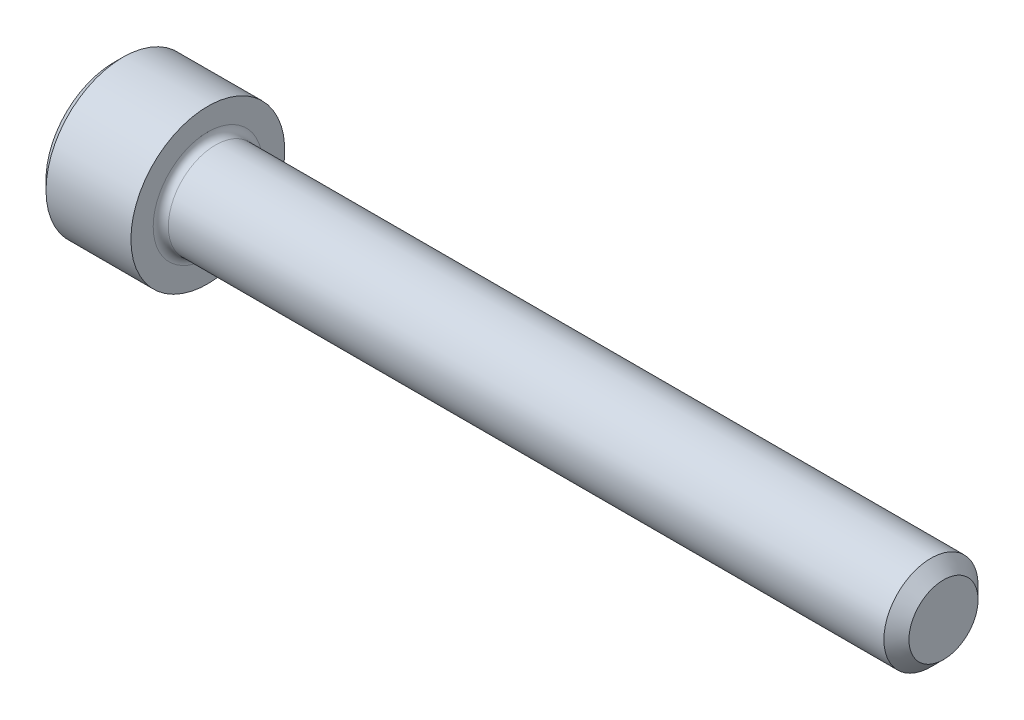
ISO-10303-21;
HEADER;
FILE_DESCRIPTION(('STEP AP214'),'2;1');
FILE_NAME('part.step','',(''),(''),'','','');
FILE_SCHEMA(('AUTOMOTIVE_DESIGN { 1 0 10303 214 1 1 1 1 }'));
ENDSEC;
DATA;
#1=APPLICATION_CONTEXT('core data for automotive mechanical design processes');
#2=APPLICATION_PROTOCOL_DEFINITION('international standard','automotive_design',2000,#1);
#3=PRODUCT_CONTEXT('',#1,'mechanical');
#4=PRODUCT('Part','Part','',(#3));
#5=PRODUCT_RELATED_PRODUCT_CATEGORY('part','',(#4));
#6=PRODUCT_DEFINITION_FORMATION('','',#4);
#7=PRODUCT_DEFINITION_CONTEXT('part definition',#1,'design');
#8=PRODUCT_DEFINITION('design','',#6,#7);
#9=PRODUCT_DEFINITION_SHAPE('','',#8);
#10=(LENGTH_UNIT() NAMED_UNIT(*) SI_UNIT(.MILLI.,.METRE.));
#11=(NAMED_UNIT(*) PLANE_ANGLE_UNIT() SI_UNIT($,.RADIAN.));
#12=(NAMED_UNIT(*) SI_UNIT($,.STERADIAN.) SOLID_ANGLE_UNIT());
#13=UNCERTAINTY_MEASURE_WITH_UNIT(LENGTH_MEASURE(1.E-05),#10,'distance_accuracy_value','');
#14=(GEOMETRIC_REPRESENTATION_CONTEXT(3) GLOBAL_UNCERTAINTY_ASSIGNED_CONTEXT((#13)) GLOBAL_UNIT_ASSIGNED_CONTEXT((#10,
#11,#12)) REPRESENTATION_CONTEXT('',''));
#15=CARTESIAN_POINT('',(0.,0.,0.));
#16=DIRECTION('',(0.,0.,1.));
#17=DIRECTION('',(1.,0.,0.));
#18=AXIS2_PLACEMENT_3D('',#15,#16,#17);
#19=CARTESIAN_POINT('',(1.29540000000361,0.,0.));
#20=DIRECTION('',(-1.,0.,0.));
#21=DIRECTION('',(0.,0.,1.));
#22=AXIS2_PLACEMENT_3D('',#19,#20,#21);
#23=CONICAL_SURFACE('',#22,1.19380000001001,1.04719755115437);
#24=CARTESIAN_POINT('',(1.98464075137395,0.,2.8421709430404E-11));
#25=VERTEX_POINT('',#24);
#26=VERTEX_LOOP('',#25);
#27=FACE_BOUND('',#26,.T.);
#28=CARTESIAN_POINT('',(1.29540000000361,0.,0.));
#29=DIRECTION('',(-1.,0.,0.));
#30=DIRECTION('',(0.,0.,1.));
#31=AXIS2_PLACEMENT_3D('',#28,#29,#30);
#32=CIRCLE('',#31,1.19380000001001);
#33=CARTESIAN_POINT('',(1.29540000000181,0.,1.19380000000501));
#34=VERTEX_POINT('',#33);
#35=CARTESIAN_POINT('',(1.29540000000181,-1.0338611270422,0.596900000002504));
#36=VERTEX_POINT('',#35);
#37=EDGE_CURVE('E99',#34,#36,#32,.F.);
#38=ORIENTED_EDGE('',*,*,#37,.F.);
#39=CARTESIAN_POINT('',(1.29540000000361,0.,0.));
#40=DIRECTION('',(-1.,0.,0.));
#41=DIRECTION('',(0.,0.,1.));
#42=AXIS2_PLACEMENT_3D('',#39,#40,#41);
#43=CIRCLE('',#42,1.19380000001001);
#44=CARTESIAN_POINT('',(1.29540000000181,1.0338611270422,0.596900000002503));
#45=VERTEX_POINT('',#44);
#46=EDGE_CURVE('E96',#45,#34,#43,.F.);
#47=ORIENTED_EDGE('',*,*,#46,.F.);
#48=CARTESIAN_POINT('',(1.29540000000361,0.,0.));
#49=DIRECTION('',(-1.,0.,0.));
#50=DIRECTION('',(0.,0.,1.));
#51=AXIS2_PLACEMENT_3D('',#48,#49,#50);
#52=CIRCLE('',#51,1.19380000001001);
#53=CARTESIAN_POINT('',(1.2954000000018,1.0338611270422,-0.596900000002507));
#54=VERTEX_POINT('',#53);
#55=EDGE_CURVE('E157',#54,#45,#52,.F.);
#56=ORIENTED_EDGE('',*,*,#55,.F.);
#57=CARTESIAN_POINT('',(1.29540000000361,0.,0.));
#58=DIRECTION('',(-1.,0.,0.));
#59=DIRECTION('',(0.,0.,1.));
#60=AXIS2_PLACEMENT_3D('',#57,#58,#59);
#61=CIRCLE('',#60,1.19380000001001);
#62=CARTESIAN_POINT('',(1.29540000000181,0.,-1.19380000000501));
#63=VERTEX_POINT('',#62);
#64=EDGE_CURVE('E154',#63,#54,#61,.F.);
#65=ORIENTED_EDGE('',*,*,#64,.F.);
#66=CARTESIAN_POINT('',(1.29540000000361,0.,0.));
#67=DIRECTION('',(-1.,0.,0.));
#68=DIRECTION('',(0.,0.,1.));
#69=AXIS2_PLACEMENT_3D('',#66,#67,#68);
#70=CIRCLE('',#69,1.19380000001001);
#71=CARTESIAN_POINT('',(1.29540000000181,-1.0338611270422,-0.596900000002501));
#72=VERTEX_POINT('',#71);
#73=EDGE_CURVE('E159',#72,#63,#70,.F.);
#74=ORIENTED_EDGE('',*,*,#73,.F.);
#75=CARTESIAN_POINT('',(1.29540000000361,0.,0.));
#76=DIRECTION('',(-1.,0.,0.));
#77=DIRECTION('',(0.,0.,1.));
#78=AXIS2_PLACEMENT_3D('',#75,#76,#77);
#79=CIRCLE('',#78,1.19380000001001);
#80=EDGE_CURVE('E102',#36,#72,#79,.F.);
#81=ORIENTED_EDGE('',*,*,#80,.F.);
#82=EDGE_LOOP('',(#38,#47,#56,#65,#74,#81));
#83=FACE_BOUND('',#82,.T.);
#84=ADVANCED_FACE('F17',(#27,#83),#23,.F.);
#85=CARTESIAN_POINT('',(1.2954,0.689240751358581,1.1938));
#86=DIRECTION('',(-1.,0.,0.));
#87=DIRECTION('',(0.,0.,1.));
#88=AXIS2_PLACEMENT_3D('',#85,#86,#87);
#89=PLANE('',#88);
#90=DIRECTION('',(0.,-1.,0.));
#91=VECTOR('',#90,1.);
#92=CARTESIAN_POINT('',(1.2954,-0.689240751358569,1.1938));
#93=LINE('',#92,#91);
#94=CARTESIAN_POINT('',(1.2954,0.689240751358582,1.1938));
#95=VERTEX_POINT('',#94);
#96=EDGE_CURVE('E114',#34,#95,#93,.F.);
#97=ORIENTED_EDGE('',*,*,#96,.T.);
#98=DIRECTION('',(0.,0.499999999999999,-0.866025403784439));
#99=VECTOR('',#98,1.);
#100=CARTESIAN_POINT('',(1.2954,1.37848150271716,0.));
#101=LINE('',#100,#99);
#102=EDGE_CURVE('E115',#45,#95,#101,.F.);
#103=ORIENTED_EDGE('',*,*,#102,.F.);
#104=ORIENTED_EDGE('',*,*,#46,.T.);
#105=EDGE_LOOP('',(#97,#103,#104));
#106=FACE_BOUND('',#105,.T.);
#107=ADVANCED_FACE('F119',(#106),#89,.T.);
#108=CARTESIAN_POINT('',(1.2954,0.689240751358581,1.1938));
#109=DIRECTION('',(-1.,0.,0.));
#110=DIRECTION('',(0.,0.,1.));
#111=AXIS2_PLACEMENT_3D('',#108,#109,#110);
#112=PLANE('',#111);
#113=DIRECTION('',(0.,0.500000000000001,0.866025403784438));
#114=VECTOR('',#113,1.);
#115=CARTESIAN_POINT('',(1.2954,-0.689240751358569,1.1938));
#116=LINE('',#115,#114);
#117=CARTESIAN_POINT('',(1.2954,-0.689240751358569,1.1938));
#118=VERTEX_POINT('',#117);
#119=EDGE_CURVE('E110',#118,#36,#116,.F.);
#120=ORIENTED_EDGE('',*,*,#119,.F.);
#121=DIRECTION('',(0.,-1.,0.));
#122=VECTOR('',#121,1.);
#123=CARTESIAN_POINT('',(1.2954,-0.689240751358569,1.1938));
#124=LINE('',#123,#122);
#125=EDGE_CURVE('E107',#118,#34,#124,.F.);
#126=ORIENTED_EDGE('',*,*,#125,.T.);
#127=ORIENTED_EDGE('',*,*,#37,.T.);
#128=EDGE_LOOP('',(#120,#126,#127));
#129=FACE_BOUND('',#128,.T.);
#130=ADVANCED_FACE('F108',(#129),#112,.T.);
#131=CARTESIAN_POINT('',(1.2954,0.689240751358581,1.1938));
#132=DIRECTION('',(-1.,0.,0.));
#133=DIRECTION('',(0.,0.,1.));
#134=AXIS2_PLACEMENT_3D('',#131,#132,#133);
#135=PLANE('',#134);
#136=DIRECTION('',(0.,-0.499999999999998,0.86602540378444));
#137=VECTOR('',#136,1.);
#138=CARTESIAN_POINT('',(1.2954,-1.37848150271715,0.));
#139=LINE('',#138,#137);
#140=CARTESIAN_POINT('',(1.2954,-1.37848150271715,0.));
#141=VERTEX_POINT('',#140);
#142=EDGE_CURVE('E416',#141,#72,#139,.F.);
#143=ORIENTED_EDGE('',*,*,#142,.F.);
#144=DIRECTION('',(0.,0.500000000000001,0.866025403784438));
#145=VECTOR('',#144,1.);
#146=CARTESIAN_POINT('',(1.2954,-0.689240751358569,1.1938));
#147=LINE('',#146,#145);
#148=EDGE_CURVE('E418',#36,#141,#147,.F.);
#149=ORIENTED_EDGE('',*,*,#148,.F.);
#150=ORIENTED_EDGE('',*,*,#80,.T.);
#151=EDGE_LOOP('',(#143,#149,#150));
#152=FACE_BOUND('',#151,.T.);
#153=ADVANCED_FACE('F278',(#152),#135,.T.);
#154=CARTESIAN_POINT('',(1.2954,0.689240751358581,1.1938));
#155=DIRECTION('',(-1.,0.,0.));
#156=DIRECTION('',(0.,0.,1.));
#157=AXIS2_PLACEMENT_3D('',#154,#155,#156);
#158=PLANE('',#157);
#159=DIRECTION('',(0.,1.,0.));
#160=VECTOR('',#159,1.);
#161=CARTESIAN_POINT('',(1.2954,0.689240751358578,-1.1938));
#162=LINE('',#161,#160);
#163=CARTESIAN_POINT('',(1.2954,-0.689240751358572,-1.1938));
#164=VERTEX_POINT('',#163);
#165=EDGE_CURVE('E472',#63,#164,#162,.F.);
#166=ORIENTED_EDGE('',*,*,#165,.T.);
#167=DIRECTION('',(0.,-0.499999999999998,0.86602540378444));
#168=VECTOR('',#167,1.);
#169=CARTESIAN_POINT('',(1.2954,-1.37848150271715,0.));
#170=LINE('',#169,#168);
#171=EDGE_CURVE('E421',#72,#164,#170,.F.);
#172=ORIENTED_EDGE('',*,*,#171,.F.);
#173=ORIENTED_EDGE('',*,*,#73,.T.);
#174=EDGE_LOOP('',(#166,#172,#173));
#175=FACE_BOUND('',#174,.T.);
#176=ADVANCED_FACE('F274',(#175),#158,.T.);
#177=CARTESIAN_POINT('',(1.2954,0.689240751358581,1.1938));
#178=DIRECTION('',(-1.,0.,0.));
#179=DIRECTION('',(0.,0.,1.));
#180=AXIS2_PLACEMENT_3D('',#177,#178,#179);
#181=PLANE('',#180);
#182=DIRECTION('',(0.,0.499999999999999,-0.866025403784439));
#183=VECTOR('',#182,1.);
#184=CARTESIAN_POINT('',(1.2954,1.37848150271716,0.));
#185=LINE('',#184,#183);
#186=CARTESIAN_POINT('',(1.2954,1.37848150271716,0.));
#187=VERTEX_POINT('',#186);
#188=EDGE_CURVE('E137',#187,#45,#185,.F.);
#189=ORIENTED_EDGE('',*,*,#188,.F.);
#190=DIRECTION('',(0.,0.500000000000001,0.866025403784438));
#191=VECTOR('',#190,1.);
#192=CARTESIAN_POINT('',(1.2954,1.37848150271716,0.));
#193=LINE('',#192,#191);
#194=EDGE_CURVE('E487',#187,#54,#193,.F.);
#195=ORIENTED_EDGE('',*,*,#194,.T.);
#196=ORIENTED_EDGE('',*,*,#55,.T.);
#197=EDGE_LOOP('',(#189,#195,#196));
#198=FACE_BOUND('',#197,.T.);
#199=ADVANCED_FACE('F270',(#198),#181,.T.);
#200=CARTESIAN_POINT('',(1.2954,0.689240751358581,1.1938));
#201=DIRECTION('',(-1.,0.,0.));
#202=DIRECTION('',(0.,0.,1.));
#203=AXIS2_PLACEMENT_3D('',#200,#201,#202);
#204=PLANE('',#203);
#205=DIRECTION('',(0.,0.500000000000001,0.866025403784438));
#206=VECTOR('',#205,1.);
#207=CARTESIAN_POINT('',(1.2954,1.37848150271716,0.));
#208=LINE('',#207,#206);
#209=CARTESIAN_POINT('',(1.2954,0.689240751358578,-1.1938));
#210=VERTEX_POINT('',#209);
#211=EDGE_CURVE('E461',#54,#210,#208,.F.);
#212=ORIENTED_EDGE('',*,*,#211,.T.);
#213=DIRECTION('',(0.,1.,0.));
#214=VECTOR('',#213,1.);
#215=CARTESIAN_POINT('',(1.2954,0.689240751358578,-1.1938));
#216=LINE('',#215,#214);
#217=EDGE_CURVE('E475',#210,#63,#216,.F.);
#218=ORIENTED_EDGE('',*,*,#217,.T.);
#219=ORIENTED_EDGE('',*,*,#64,.T.);
#220=EDGE_LOOP('',(#212,#218,#219));
#221=FACE_BOUND('',#220,.T.);
#222=ADVANCED_FACE('F266',(#221),#204,.T.);
#223=CARTESIAN_POINT('',(1.2954,1.37848150271716,0.));
#224=DIRECTION('',(0.,-0.866025403784439,-0.499999999999999));
#225=DIRECTION('',(0.,0.499999999999999,-0.866025403784439));
#226=AXIS2_PLACEMENT_3D('',#223,#224,#225);
#227=PLANE('',#226);
#228=ORIENTED_EDGE('',*,*,#102,.T.);
#229=DIRECTION('',(1.,0.,0.));
#230=VECTOR('',#229,1.);
#231=CARTESIAN_POINT('',(1.2954,0.689240751358582,1.1938));
#232=LINE('',#231,#230);
#233=CARTESIAN_POINT('',(0.,0.689240751358582,1.1938));
#234=VERTEX_POINT('',#233);
#235=EDGE_CURVE('E126',#95,#234,#232,.F.);
#236=ORIENTED_EDGE('',*,*,#235,.T.);
#237=DIRECTION('',(0.,-0.499999999999999,0.866025403784439));
#238=VECTOR('',#237,1.);
#239=CARTESIAN_POINT('',(0.,1.37848150271716,0.));
#240=LINE('',#239,#238);
#241=CARTESIAN_POINT('',(0.,1.37848150271716,0.));
#242=VERTEX_POINT('',#241);
#243=EDGE_CURVE('E455',#242,#234,#240,.T.);
#244=ORIENTED_EDGE('',*,*,#243,.F.);
#245=DIRECTION('',(1.,0.,0.));
#246=VECTOR('',#245,1.);
#247=CARTESIAN_POINT('',(1.2954,1.37848150271716,0.));
#248=LINE('',#247,#246);
#249=EDGE_CURVE('E482',#242,#187,#248,.T.);
#250=ORIENTED_EDGE('',*,*,#249,.T.);
#251=ORIENTED_EDGE('',*,*,#188,.T.);
#252=EDGE_LOOP('',(#228,#236,#244,#250,#251));
#253=FACE_BOUND('',#252,.T.);
#254=ADVANCED_FACE('F263',(#253),#227,.T.);
#255=CARTESIAN_POINT('',(1.2954,-0.689240751358569,1.1938));
#256=DIRECTION('',(0.,0.,1.));
#257=DIRECTION('',(0.,-1.,0.));
#258=AXIS2_PLACEMENT_3D('',#255,#256,#257);
#259=PLANE('',#258);
#260=ORIENTED_EDGE('',*,*,#235,.F.);
#261=ORIENTED_EDGE('',*,*,#96,.F.);
#262=ORIENTED_EDGE('',*,*,#125,.F.);
#263=DIRECTION('',(1.,0.,0.));
#264=VECTOR('',#263,1.);
#265=CARTESIAN_POINT('',(1.2954,-0.689240751358569,1.1938));
#266=LINE('',#265,#264);
#267=CARTESIAN_POINT('',(0.,-0.689240751358569,1.1938));
#268=VERTEX_POINT('',#267);
#269=EDGE_CURVE('E128',#268,#118,#266,.T.);
#270=ORIENTED_EDGE('',*,*,#269,.F.);
#271=DIRECTION('',(0.,1.,0.));
#272=VECTOR('',#271,1.);
#273=CARTESIAN_POINT('',(0.,0.,1.1938));
#274=LINE('',#273,#272);
#275=EDGE_CURVE('E444',#234,#268,#274,.F.);
#276=ORIENTED_EDGE('',*,*,#275,.F.);
#277=EDGE_LOOP('',(#260,#261,#262,#270,#276));
#278=FACE_BOUND('',#277,.T.);
#279=ADVANCED_FACE('F124',(#278),#259,.F.);
#280=CARTESIAN_POINT('',(1.2954,-0.689240751358569,1.1938));
#281=DIRECTION('',(0.,0.866025403784438,-0.500000000000001));
#282=DIRECTION('',(0.,0.500000000000001,0.866025403784438));
#283=AXIS2_PLACEMENT_3D('',#280,#281,#282);
#284=PLANE('',#283);
#285=ORIENTED_EDGE('',*,*,#148,.T.);
#286=DIRECTION('',(1.,0.,0.));
#287=VECTOR('',#286,1.);
#288=CARTESIAN_POINT('',(1.2954,-1.37848150271715,0.));
#289=LINE('',#288,#287);
#290=CARTESIAN_POINT('',(0.,-1.37848150271715,0.));
#291=VERTEX_POINT('',#290);
#292=EDGE_CURVE('E422',#291,#141,#289,.T.);
#293=ORIENTED_EDGE('',*,*,#292,.F.);
#294=DIRECTION('',(0.,-0.500000000000001,-0.866025403784438));
#295=VECTOR('',#294,1.);
#296=CARTESIAN_POINT('',(0.,-0.689240751358569,1.1938));
#297=LINE('',#296,#295);
#298=EDGE_CURVE('E440',#268,#291,#297,.T.);
#299=ORIENTED_EDGE('',*,*,#298,.F.);
#300=ORIENTED_EDGE('',*,*,#269,.T.);
#301=ORIENTED_EDGE('',*,*,#119,.T.);
#302=EDGE_LOOP('',(#285,#293,#299,#300,#301));
#303=FACE_BOUND('',#302,.T.);
#304=ADVANCED_FACE('F256',(#303),#284,.T.);
#305=CARTESIAN_POINT('',(1.2954,-1.37848150271715,0.));
#306=DIRECTION('',(0.,0.86602540378444,0.499999999999998));
#307=DIRECTION('',(0.,-0.499999999999998,0.86602540378444));
#308=AXIS2_PLACEMENT_3D('',#305,#306,#307);
#309=PLANE('',#308);
#310=ORIENTED_EDGE('',*,*,#171,.T.);
#311=DIRECTION('',(1.,0.,0.));
#312=VECTOR('',#311,1.);
#313=CARTESIAN_POINT('',(1.2954,-0.689240751358573,-1.1938));
#314=LINE('',#313,#312);
#315=CARTESIAN_POINT('',(0.,-0.689240751358573,-1.1938));
#316=VERTEX_POINT('',#315);
#317=EDGE_CURVE('E474',#164,#316,#314,.F.);
#318=ORIENTED_EDGE('',*,*,#317,.T.);
#319=DIRECTION('',(0.,0.499999999999998,-0.86602540378444));
#320=VECTOR('',#319,1.);
#321=CARTESIAN_POINT('',(0.,-1.37848150271715,0.));
#322=LINE('',#321,#320);
#323=EDGE_CURVE('E426',#291,#316,#322,.T.);
#324=ORIENTED_EDGE('',*,*,#323,.F.);
#325=ORIENTED_EDGE('',*,*,#292,.T.);
#326=ORIENTED_EDGE('',*,*,#142,.T.);
#327=EDGE_LOOP('',(#310,#318,#324,#325,#326));
#328=FACE_BOUND('',#327,.T.);
#329=ADVANCED_FACE('F252',(#328),#309,.T.);
#330=CARTESIAN_POINT('',(1.2954,0.689240751358578,-1.1938));
#331=DIRECTION('',(0.,0.,-1.));
#332=DIRECTION('',(0.,1.,0.));
#333=AXIS2_PLACEMENT_3D('',#330,#331,#332);
#334=PLANE('',#333);
#335=ORIENTED_EDGE('',*,*,#317,.F.);
#336=ORIENTED_EDGE('',*,*,#165,.F.);
#337=ORIENTED_EDGE('',*,*,#217,.F.);
#338=DIRECTION('',(1.,0.,0.));
#339=VECTOR('',#338,1.);
#340=CARTESIAN_POINT('',(1.2954,0.689240751358578,-1.1938));
#341=LINE('',#340,#339);
#342=CARTESIAN_POINT('',(0.,0.689240751358578,-1.1938));
#343=VERTEX_POINT('',#342);
#344=EDGE_CURVE('E458',#210,#343,#341,.F.);
#345=ORIENTED_EDGE('',*,*,#344,.T.);
#346=DIRECTION('',(0.,1.,0.));
#347=VECTOR('',#346,1.);
#348=CARTESIAN_POINT('',(0.,0.,-1.1938));
#349=LINE('',#348,#347);
#350=EDGE_CURVE('E439',#316,#343,#349,.T.);
#351=ORIENTED_EDGE('',*,*,#350,.F.);
#352=EDGE_LOOP('',(#335,#336,#337,#345,#351));
#353=FACE_BOUND('',#352,.T.);
#354=ADVANCED_FACE('F248',(#353),#334,.F.);
#355=CARTESIAN_POINT('',(1.2954,1.37848150271716,0.));
#356=DIRECTION('',(0.,0.866025403784438,-0.500000000000001));
#357=DIRECTION('',(0.,0.500000000000001,0.866025403784438));
#358=AXIS2_PLACEMENT_3D('',#355,#356,#357);
#359=PLANE('',#358);
#360=ORIENTED_EDGE('',*,*,#344,.F.);
#361=ORIENTED_EDGE('',*,*,#211,.F.);
#362=ORIENTED_EDGE('',*,*,#194,.F.);
#363=ORIENTED_EDGE('',*,*,#249,.F.);
#364=DIRECTION('',(0.,0.500000000000001,0.866025403784438));
#365=VECTOR('',#364,1.);
#366=CARTESIAN_POINT('',(0.,0.689240751358578,-1.1938));
#367=LINE('',#366,#365);
#368=EDGE_CURVE('E153',#343,#242,#367,.T.);
#369=ORIENTED_EDGE('',*,*,#368,.F.);
#370=EDGE_LOOP('',(#360,#361,#362,#363,#369));
#371=FACE_BOUND('',#370,.T.);
#372=ADVANCED_FACE('F244',(#371),#359,.F.);
#373=CARTESIAN_POINT('',(0.,0.,0.));
#374=DIRECTION('',(-1.,0.,0.));
#375=DIRECTION('',(0.,0.,1.));
#376=AXIS2_PLACEMENT_3D('',#373,#374,#375);
#377=PLANE('',#376);
#378=CARTESIAN_POINT('',(0.,0.,0.));
#379=DIRECTION('',(1.,0.,0.));
#380=DIRECTION('',(0.,0.,-1.));
#381=AXIS2_PLACEMENT_3D('',#378,#379,#380);
#382=CIRCLE('',#381,2.04469999994217);
#383=CARTESIAN_POINT('',(0.,0.,-2.04469999994217));
#384=VERTEX_POINT('',#383);
#385=EDGE_CURVE('E150',#384,#384,#382,.T.);
#386=ORIENTED_EDGE('',*,*,#385,.F.);
#387=EDGE_LOOP('',(#386));
#388=FACE_BOUND('',#387,.T.);
#389=ORIENTED_EDGE('',*,*,#350,.T.);
#390=ORIENTED_EDGE('',*,*,#368,.T.);
#391=ORIENTED_EDGE('',*,*,#243,.T.);
#392=ORIENTED_EDGE('',*,*,#275,.T.);
#393=ORIENTED_EDGE('',*,*,#298,.T.);
#394=ORIENTED_EDGE('',*,*,#323,.T.);
#395=EDGE_LOOP('',(#389,#390,#391,#392,#393,#394));
#396=FACE_BOUND('',#395,.T.);
#397=ADVANCED_FACE('F236',(#388,#396),#377,.T.);
#398=CARTESIAN_POINT('',(0.27940000001081,0.,0.));
#399=DIRECTION('',(1.,0.,0.));
#400=DIRECTION('',(0.,0.,-1.));
#401=AXIS2_PLACEMENT_3D('',#398,#399,#400);
#402=CONICAL_SURFACE('',#401,2.32409999995298,0.785398163397448);
#403=ORIENTED_EDGE('',*,*,#385,.T.);
#404=EDGE_LOOP('',(#403));
#405=FACE_BOUND('',#404,.T.);
#406=CARTESIAN_POINT('',(0.279399999999999,0.,0.));
#407=DIRECTION('',(-1.,0.,0.));
#408=DIRECTION('',(0.,0.,1.));
#409=AXIS2_PLACEMENT_3D('',#406,#407,#408);
#410=CIRCLE('',#409,2.3241);
#411=CARTESIAN_POINT('',(0.279399999999999,0.,2.3241));
#412=VERTEX_POINT('',#411);
#413=EDGE_CURVE('E149',#412,#412,#410,.F.);
#414=ORIENTED_EDGE('',*,*,#413,.F.);
#415=EDGE_LOOP('',(#414));
#416=FACE_BOUND('',#415,.T.);
#417=ADVANCED_FACE('F231',(#405,#416),#402,.T.);
#418=CARTESIAN_POINT('',(-31.75,0.,0.));
#419=DIRECTION('',(-1.,0.,0.));
#420=DIRECTION('',(0.,0.,1.));
#421=AXIS2_PLACEMENT_3D('',#418,#419,#420);
#422=CYLINDRICAL_SURFACE('',#421,2.3241);
#423=CARTESIAN_POINT('',(2.8448,0.,0.));
#424=DIRECTION('',(-1.,0.,0.));
#425=DIRECTION('',(0.,0.,1.));
#426=AXIS2_PLACEMENT_3D('',#423,#424,#425);
#427=CIRCLE('',#426,2.3241);
#428=CARTESIAN_POINT('',(2.8448,0.,2.3241));
#429=VERTEX_POINT('',#428);
#430=EDGE_CURVE('E146',#429,#429,#427,.F.);
#431=ORIENTED_EDGE('',*,*,#430,.F.);
#432=EDGE_LOOP('',(#431));
#433=FACE_BOUND('',#432,.T.);
#434=ORIENTED_EDGE('',*,*,#413,.T.);
#435=EDGE_LOOP('',(#434));
#436=FACE_BOUND('',#435,.T.);
#437=ADVANCED_FACE('F227',(#433,#436),#422,.T.);
#438=CARTESIAN_POINT('',(25.0698,1.04394,0.));
#439=DIRECTION('',(1.,0.,0.));
#440=DIRECTION('',(0.,0.,-1.));
#441=AXIS2_PLACEMENT_3D('',#438,#439,#440);
#442=PLANE('',#441);
#443=CARTESIAN_POINT('',(25.0697999999829,0.,0.));
#444=DIRECTION('',(-1.,0.,0.));
#445=DIRECTION('',(0.,0.,1.));
#446=AXIS2_PLACEMENT_3D('',#443,#444,#445);
#447=CIRCLE('',#446,1.04394000004504);
#448=CARTESIAN_POINT('',(25.0697999999829,0.,1.04394000004504));
#449=VERTEX_POINT('',#448);
#450=EDGE_CURVE('E142',#449,#449,#447,.T.);
#451=ORIENTED_EDGE('',*,*,#450,.F.);
#452=EDGE_LOOP('',(#451));
#453=FACE_BOUND('',#452,.T.);
#454=ADVANCED_FACE('F185',(#453),#442,.T.);
#455=CARTESIAN_POINT('',(2.8448,2.3241,0.));
#456=DIRECTION('',(1.,0.,0.));
#457=DIRECTION('',(0.,0.,-1.));
#458=AXIS2_PLACEMENT_3D('',#455,#456,#457);
#459=PLANE('',#458);
#460=ORIENTED_EDGE('',*,*,#430,.T.);
#461=EDGE_LOOP('',(#460));
#462=FACE_BOUND('',#461,.T.);
#463=CARTESIAN_POINT('',(2.8448,0.,0.));
#464=DIRECTION('',(1.,0.,0.));
#465=DIRECTION('',(0.,0.,1.));
#466=AXIS2_PLACEMENT_3D('',#463,#464,#465);
#467=CIRCLE('',#466,1.65099999999998);
#468=CARTESIAN_POINT('',(2.8448,0.,-1.65099999999998));
#469=VERTEX_POINT('',#468);
#470=CARTESIAN_POINT('',(2.8448,0.,1.65099999999998));
#471=VERTEX_POINT('',#470);
#472=EDGE_CURVE('E145',#469,#471,#467,.F.);
#473=ORIENTED_EDGE('',*,*,#472,.T.);
#474=CARTESIAN_POINT('',(2.8448,0.,0.));
#475=DIRECTION('',(1.,0.,0.));
#476=DIRECTION('',(0.,0.,-1.));
#477=AXIS2_PLACEMENT_3D('',#474,#475,#476);
#478=CIRCLE('',#477,1.65099999999998);
#479=EDGE_CURVE('E36',#471,#469,#478,.F.);
#480=ORIENTED_EDGE('',*,*,#479,.T.);
#481=EDGE_LOOP('',(#473,#480));
#482=FACE_BOUND('',#481,.T.);
#483=ADVANCED_FACE('F166',(#462,#482),#459,.T.);
#484=CARTESIAN_POINT('',(24.6913400000039,0.,0.));
#485=DIRECTION('',(-1.,0.,0.));
#486=DIRECTION('',(0.,0.,1.));
#487=AXIS2_PLACEMENT_3D('',#484,#485,#486);
#488=CONICAL_SURFACE('',#487,1.42240000002403,0.785398163397448);
#489=CARTESIAN_POINT('',(24.69134,0.,0.));
#490=DIRECTION('',(-1.,0.,0.));
#491=DIRECTION('',(0.,0.,1.));
#492=AXIS2_PLACEMENT_3D('',#489,#490,#491);
#493=CIRCLE('',#492,1.42239999999998);
#494=CARTESIAN_POINT('',(24.69134,0.,1.42239999999998));
#495=VERTEX_POINT('',#494);
#496=EDGE_CURVE('E28',#495,#495,#493,.T.);
#497=ORIENTED_EDGE('',*,*,#496,.F.);
#498=EDGE_LOOP('',(#497));
#499=FACE_BOUND('',#498,.T.);
#500=ORIENTED_EDGE('',*,*,#450,.T.);
#501=EDGE_LOOP('',(#500));
#502=FACE_BOUND('',#501,.T.);
#503=ADVANCED_FACE('F184',(#499,#502),#488,.T.);
#504=CARTESIAN_POINT('',(3.0734,0.,0.));
#505=DIRECTION('',(1.,0.,0.));
#506=DIRECTION('',(0.,0.,-1.));
#507=AXIS2_PLACEMENT_3D('',#504,#505,#506);
#508=TOROIDAL_SURFACE('',#507,1.65099999999998,0.2286);
#509=CARTESIAN_POINT('',(3.0734,0.,0.));
#510=DIRECTION('',(-1.,0.,0.));
#511=DIRECTION('',(0.,0.,1.));
#512=AXIS2_PLACEMENT_3D('',#509,#510,#511);
#513=CIRCLE('',#512,1.42239999999998);
#514=CARTESIAN_POINT('',(3.0734,0.,1.42239999999998));
#515=VERTEX_POINT('',#514);
#516=EDGE_CURVE('E11',#515,#515,#513,.F.);
#517=ORIENTED_EDGE('',*,*,#516,.F.);
#518=EDGE_LOOP('',(#517));
#519=FACE_BOUND('',#518,.T.);
#520=ORIENTED_EDGE('',*,*,#472,.F.);
#521=ORIENTED_EDGE('',*,*,#479,.F.);
#522=EDGE_LOOP('',(#520,#521));
#523=FACE_BOUND('',#522,.T.);
#524=ADVANCED_FACE('F163',(#519,#523),#508,.F.);
#525=CARTESIAN_POINT('',(-31.75,0.,0.));
#526=DIRECTION('',(-1.,0.,0.));
#527=DIRECTION('',(0.,0.,1.));
#528=AXIS2_PLACEMENT_3D('',#525,#526,#527);
#529=CYLINDRICAL_SURFACE('',#528,1.42239999999998);
#530=ORIENTED_EDGE('',*,*,#516,.T.);
#531=EDGE_LOOP('',(#530));
#532=FACE_BOUND('',#531,.T.);
#533=ORIENTED_EDGE('',*,*,#496,.T.);
#534=EDGE_LOOP('',(#533));
#535=FACE_BOUND('',#534,.T.);
#536=ADVANCED_FACE('F209',(#532,#535),#529,.T.);
#537=CLOSED_SHELL('',(#84,#107,#130,#153,#176,#199,#222,#254,#279,#304,#329,#354,#372,#397,#417,
#437,#454,#483,#503,#524,#536));
#538=MANIFOLD_SOLID_BREP('B1',#537);
#539=ADVANCED_BREP_SHAPE_REPRESENTATION('',(#18,#538),#14);
#540=SHAPE_DEFINITION_REPRESENTATION(#9,#539);
ENDSEC;
END-ISO-10303-21;
